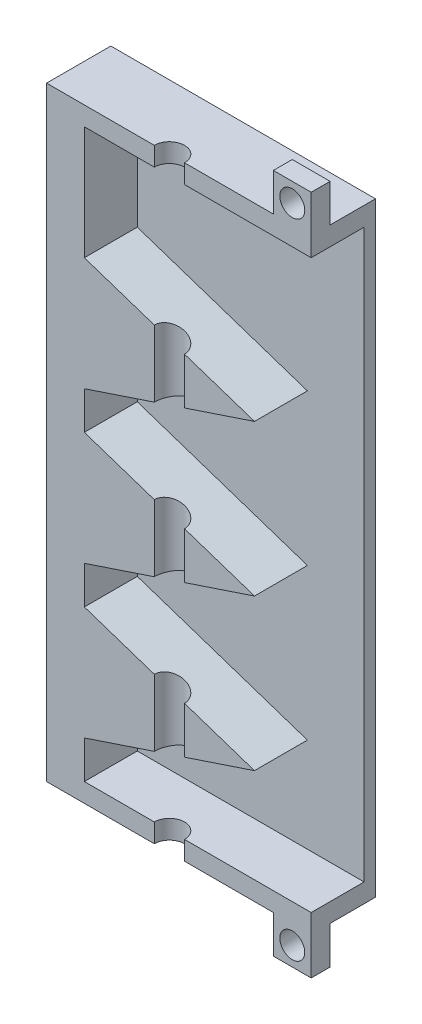
ISO-10303-21;
HEADER;
FILE_DESCRIPTION(('STEP AP214'),'2;1');
FILE_NAME('part.step','',(''),(''),'','','');
FILE_SCHEMA(('AUTOMOTIVE_DESIGN { 1 0 10303 214 1 1 1 1 }'));
ENDSEC;
DATA;
#1=APPLICATION_CONTEXT('core data for automotive mechanical design processes');
#2=APPLICATION_PROTOCOL_DEFINITION('international standard','automotive_design',2000,#1);
#3=PRODUCT_CONTEXT('',#1,'mechanical');
#4=PRODUCT('Part','Part','',(#3));
#5=PRODUCT_RELATED_PRODUCT_CATEGORY('part','',(#4));
#6=PRODUCT_DEFINITION_FORMATION('','',#4);
#7=PRODUCT_DEFINITION_CONTEXT('part definition',#1,'design');
#8=PRODUCT_DEFINITION('design','',#6,#7);
#9=PRODUCT_DEFINITION_SHAPE('','',#8);
#10=(LENGTH_UNIT() NAMED_UNIT(*) SI_UNIT(.MILLI.,.METRE.));
#11=(NAMED_UNIT(*) PLANE_ANGLE_UNIT() SI_UNIT($,.RADIAN.));
#12=(NAMED_UNIT(*) SI_UNIT($,.STERADIAN.) SOLID_ANGLE_UNIT());
#13=UNCERTAINTY_MEASURE_WITH_UNIT(LENGTH_MEASURE(1.E-05),#10,'distance_accuracy_value','');
#14=(GEOMETRIC_REPRESENTATION_CONTEXT(3) GLOBAL_UNCERTAINTY_ASSIGNED_CONTEXT((#13)) GLOBAL_UNIT_ASSIGNED_CONTEXT((#10,
#11,#12)) REPRESENTATION_CONTEXT('',''));
#15=CARTESIAN_POINT('',(0.,0.,0.));
#16=DIRECTION('',(0.,0.,1.));
#17=DIRECTION('',(1.,0.,0.));
#18=AXIS2_PLACEMENT_3D('',#15,#16,#17);
#19=CARTESIAN_POINT('',(0.,0.,-8.5));
#20=DIRECTION('',(0.,0.,-1.));
#21=DIRECTION('',(-1.,0.,0.));
#22=AXIS2_PLACEMENT_3D('',#19,#20,#21);
#23=PLANE('',#22);
#24=DIRECTION('',(0.,1.,0.));
#25=VECTOR('',#24,1.);
#26=CARTESIAN_POINT('',(18.25,-5.65685424949239,-8.5));
#27=LINE('',#26,#25);
#28=CARTESIAN_POINT('',(18.25,31.9166666666667,-8.5));
#29=VERTEX_POINT('',#28);
#30=CARTESIAN_POINT('',(18.25,38.0833333333333,-8.5));
#31=VERTEX_POINT('',#30);
#32=EDGE_CURVE('E446',#29,#31,#27,.T.);
#33=ORIENTED_EDGE('',*,*,#32,.F.);
#34=DIRECTION('',(-0.948683298050514,-0.316227766016838,0.));
#35=VECTOR('',#34,1.);
#36=CARTESIAN_POINT('',(5.00000000000001,27.5,-8.5));
#37=LINE('',#36,#35);
#38=CARTESIAN_POINT('',(27.5,35.,-8.5));
#39=VERTEX_POINT('',#38);
#40=EDGE_CURVE('E437',#39,#29,#37,.T.);
#41=ORIENTED_EDGE('',*,*,#40,.F.);
#42=DIRECTION('',(0.948683298050514,-0.316227766016838,0.));
#43=VECTOR('',#42,1.);
#44=CARTESIAN_POINT('',(27.5,35.,-8.5));
#45=LINE('',#44,#43);
#46=EDGE_CURVE('E439',#31,#39,#45,.T.);
#47=ORIENTED_EDGE('',*,*,#46,.F.);
#48=EDGE_LOOP('',(#33,#41,#47));
#49=FACE_BOUND('',#48,.T.);
#50=ADVANCED_FACE('F35',(#49),#23,.F.);
#51=DIRECTION('',(0.,1.,0.));
#52=VECTOR('',#51,1.);
#53=CARTESIAN_POINT('',(18.25,-5.65685424949239,-8.5));
#54=LINE('',#53,#52);
#55=CARTESIAN_POINT('',(18.25,51.9166666666667,-8.5));
#56=VERTEX_POINT('',#55);
#57=CARTESIAN_POINT('',(18.25,58.0833333333333,-8.5));
#58=VERTEX_POINT('',#57);
#59=EDGE_CURVE('E428',#56,#58,#54,.T.);
#60=ORIENTED_EDGE('',*,*,#59,.F.);
#61=DIRECTION('',(-0.948683298050514,-0.316227766016838,0.));
#62=VECTOR('',#61,1.);
#63=CARTESIAN_POINT('',(5.00000000000001,47.5,-8.5));
#64=LINE('',#63,#62);
#65=CARTESIAN_POINT('',(27.5,55.,-8.5));
#66=VERTEX_POINT('',#65);
#67=EDGE_CURVE('E451',#66,#56,#64,.T.);
#68=ORIENTED_EDGE('',*,*,#67,.F.);
#69=DIRECTION('',(0.948683298050514,-0.316227766016838,0.));
#70=VECTOR('',#69,1.);
#71=CARTESIAN_POINT('',(27.5,55.,-8.5));
#72=LINE('',#71,#70);
#73=EDGE_CURVE('E443',#58,#66,#72,.T.);
#74=ORIENTED_EDGE('',*,*,#73,.F.);
#75=EDGE_LOOP('',(#60,#68,#74));
#76=FACE_BOUND('',#75,.T.);
#77=ADVANCED_FACE('F518',(#76),#23,.F.);
#78=DIRECTION('',(0.,1.,0.));
#79=VECTOR('',#78,1.);
#80=CARTESIAN_POINT('',(18.25,-5.65685424949239,-8.5));
#81=LINE('',#80,#79);
#82=CARTESIAN_POINT('',(18.25,11.9166666666667,-8.5));
#83=VERTEX_POINT('',#82);
#84=CARTESIAN_POINT('',(18.25,18.0833333333333,-8.5));
#85=VERTEX_POINT('',#84);
#86=EDGE_CURVE('E425',#83,#85,#81,.T.);
#87=ORIENTED_EDGE('',*,*,#86,.F.);
#88=DIRECTION('',(-0.948683298050514,-0.316227766016838,0.));
#89=VECTOR('',#88,1.);
#90=CARTESIAN_POINT('',(5.00000000000001,7.49999999999999,-8.5));
#91=LINE('',#90,#89);
#92=CARTESIAN_POINT('',(27.5,15.,-8.5));
#93=VERTEX_POINT('',#92);
#94=EDGE_CURVE('E415',#93,#83,#91,.T.);
#95=ORIENTED_EDGE('',*,*,#94,.F.);
#96=DIRECTION('',(0.948683298050514,-0.316227766016838,0.));
#97=VECTOR('',#96,1.);
#98=CARTESIAN_POINT('',(27.5,15.,-8.5));
#99=LINE('',#98,#97);
#100=EDGE_CURVE('E417',#85,#93,#99,.T.);
#101=ORIENTED_EDGE('',*,*,#100,.F.);
#102=EDGE_LOOP('',(#87,#95,#101));
#103=FACE_BOUND('',#102,.T.);
#104=ADVANCED_FACE('F524',(#103),#23,.F.);
#105=DIRECTION('',(1.,0.,0.));
#106=VECTOR('',#105,1.);
#107=CARTESIAN_POINT('',(0.,80.,-8.5));
#108=LINE('',#107,#106);
#109=CARTESIAN_POINT('',(18.25,80.,-8.5));
#110=VERTEX_POINT('',#109);
#111=CARTESIAN_POINT('',(30.,80.,-8.5));
#112=VERTEX_POINT('',#111);
#113=EDGE_CURVE('E420',#110,#112,#108,.T.);
#114=ORIENTED_EDGE('',*,*,#113,.F.);
#115=DIRECTION('',(0.,1.,0.));
#116=VECTOR('',#115,1.);
#117=CARTESIAN_POINT('',(18.25,-5.65685424949239,-8.5));
#118=LINE('',#117,#116);
#119=CARTESIAN_POINT('',(18.25,77.5,-8.5));
#120=VERTEX_POINT('',#119);
#121=EDGE_CURVE('E395',#120,#110,#118,.T.);
#122=ORIENTED_EDGE('',*,*,#121,.F.);
#123=DIRECTION('',(1.,0.,0.));
#124=VECTOR('',#123,1.);
#125=CARTESIAN_POINT('',(5.,77.5,-8.5));
#126=LINE('',#125,#124);
#127=CARTESIAN_POINT('',(35.,77.5,-8.5));
#128=VERTEX_POINT('',#127);
#129=EDGE_CURVE('E410',#120,#128,#126,.T.);
#130=ORIENTED_EDGE('',*,*,#129,.T.);
#131=DIRECTION('',(0.,-1.,0.));
#132=VECTOR('',#131,1.);
#133=CARTESIAN_POINT('',(35.,80.,-8.5));
#134=LINE('',#133,#132);
#135=CARTESIAN_POINT('',(35.,85.,-8.5));
#136=VERTEX_POINT('',#135);
#137=EDGE_CURVE('E59',#136,#128,#134,.T.);
#138=ORIENTED_EDGE('',*,*,#137,.F.);
#139=DIRECTION('',(1.,0.,0.));
#140=VECTOR('',#139,1.);
#141=CARTESIAN_POINT('',(0.,85.,-8.5));
#142=LINE('',#141,#140);
#143=CARTESIAN_POINT('',(30.,85.,-8.5));
#144=VERTEX_POINT('',#143);
#145=EDGE_CURVE('E456',#144,#136,#142,.T.);
#146=ORIENTED_EDGE('',*,*,#145,.F.);
#147=DIRECTION('',(0.,1.,0.));
#148=VECTOR('',#147,1.);
#149=CARTESIAN_POINT('',(30.,85.,-8.5));
#150=LINE('',#149,#148);
#151=EDGE_CURVE('E458',#112,#144,#150,.T.);
#152=ORIENTED_EDGE('',*,*,#151,.F.);
#153=EDGE_LOOP('',(#114,#122,#130,#138,#146,#152));
#154=FACE_BOUND('',#153,.T.);
#155=CARTESIAN_POINT('',(32.5,82.5,-8.5));
#156=DIRECTION('',(0.,0.,-1.));
#157=DIRECTION('',(-1.,0.,0.));
#158=AXIS2_PLACEMENT_3D('',#155,#156,#157);
#159=CIRCLE('',#158,1.65);
#160=CARTESIAN_POINT('',(30.85,82.5,-8.5));
#161=VERTEX_POINT('',#160);
#162=EDGE_CURVE('E39',#161,#161,#159,.F.);
#163=ORIENTED_EDGE('',*,*,#162,.F.);
#164=EDGE_LOOP('',(#163));
#165=FACE_BOUND('',#164,.T.);
#166=ADVANCED_FACE('F519',(#154,#165),#23,.F.);
#167=DIRECTION('',(0.,1.,0.));
#168=VECTOR('',#167,1.);
#169=CARTESIAN_POINT('',(5.,2.5,-8.5));
#170=LINE('',#169,#168);
#171=CARTESIAN_POINT('',(5.,42.5,-8.5));
#172=VERTEX_POINT('',#171);
#173=CARTESIAN_POINT('',(5.,47.5,-8.5));
#174=VERTEX_POINT('',#173);
#175=EDGE_CURVE('E405',#172,#174,#170,.T.);
#176=ORIENTED_EDGE('',*,*,#175,.T.);
#177=CARTESIAN_POINT('',(14.25,50.5833333333333,-8.5));
#178=VERTEX_POINT('',#177);
#179=EDGE_CURVE('E450',#178,#174,#64,.T.);
#180=ORIENTED_EDGE('',*,*,#179,.F.);
#181=DIRECTION('',(0.,1.,0.));
#182=VECTOR('',#181,1.);
#183=CARTESIAN_POINT('',(14.25,-5.65685424949239,-8.5));
#184=LINE('',#183,#182);
#185=CARTESIAN_POINT('',(14.25,59.4166666666667,-8.5));
#186=VERTEX_POINT('',#185);
#187=EDGE_CURVE('E444',#186,#178,#184,.F.);
#188=ORIENTED_EDGE('',*,*,#187,.F.);
#189=CARTESIAN_POINT('',(5.,62.5,-8.5));
#190=VERTEX_POINT('',#189);
#191=EDGE_CURVE('E441',#190,#186,#72,.T.);
#192=ORIENTED_EDGE('',*,*,#191,.F.);
#193=DIRECTION('',(0.,1.,0.));
#194=VECTOR('',#193,1.);
#195=CARTESIAN_POINT('',(5.,2.5,-8.5));
#196=LINE('',#195,#194);
#197=CARTESIAN_POINT('',(5.,77.5,-8.5));
#198=VERTEX_POINT('',#197);
#199=EDGE_CURVE('E414',#190,#198,#196,.T.);
#200=ORIENTED_EDGE('',*,*,#199,.T.);
#201=CARTESIAN_POINT('',(14.25,77.5,-8.5));
#202=VERTEX_POINT('',#201);
#203=EDGE_CURVE('E399',#198,#202,#126,.T.);
#204=ORIENTED_EDGE('',*,*,#203,.T.);
#205=DIRECTION('',(0.,1.,0.));
#206=VECTOR('',#205,1.);
#207=CARTESIAN_POINT('',(14.25,-5.65685424949239,-8.5));
#208=LINE('',#207,#206);
#209=CARTESIAN_POINT('',(14.25,80.,-8.5));
#210=VERTEX_POINT('',#209);
#211=EDGE_CURVE('E423',#210,#202,#208,.F.);
#212=ORIENTED_EDGE('',*,*,#211,.F.);
#213=CARTESIAN_POINT('',(0.,80.,-8.5));
#214=VERTEX_POINT('',#213);
#215=EDGE_CURVE('E421',#214,#210,#108,.T.);
#216=ORIENTED_EDGE('',*,*,#215,.F.);
#217=DIRECTION('',(0.,1.,0.));
#218=VECTOR('',#217,1.);
#219=CARTESIAN_POINT('',(0.,80.,-8.5));
#220=LINE('',#219,#218);
#221=CARTESIAN_POINT('',(0.,0.,-8.5));
#222=VERTEX_POINT('',#221);
#223=EDGE_CURVE('E402',#222,#214,#220,.T.);
#224=ORIENTED_EDGE('',*,*,#223,.F.);
#225=DIRECTION('',(1.,0.,0.));
#226=VECTOR('',#225,1.);
#227=CARTESIAN_POINT('',(0.,0.,-8.5));
#228=LINE('',#227,#226);
#229=CARTESIAN_POINT('',(14.25,0.,-8.5));
#230=VERTEX_POINT('',#229);
#231=EDGE_CURVE('E406',#222,#230,#228,.T.);
#232=ORIENTED_EDGE('',*,*,#231,.T.);
#233=DIRECTION('',(0.,1.,0.));
#234=VECTOR('',#233,1.);
#235=CARTESIAN_POINT('',(14.25,-5.65685424949239,-8.5));
#236=LINE('',#235,#234);
#237=CARTESIAN_POINT('',(14.25,2.5,-8.5));
#238=VERTEX_POINT('',#237);
#239=EDGE_CURVE('E393',#238,#230,#236,.F.);
#240=ORIENTED_EDGE('',*,*,#239,.F.);
#241=DIRECTION('',(-1.,0.,0.));
#242=VECTOR('',#241,1.);
#243=CARTESIAN_POINT('',(5.,2.5,-8.5));
#244=LINE('',#243,#242);
#245=CARTESIAN_POINT('',(5.,2.5,-8.5));
#246=VERTEX_POINT('',#245);
#247=EDGE_CURVE('E396',#238,#246,#244,.T.);
#248=ORIENTED_EDGE('',*,*,#247,.T.);
#249=DIRECTION('',(0.,1.,0.));
#250=VECTOR('',#249,1.);
#251=CARTESIAN_POINT('',(5.,2.5,-8.5));
#252=LINE('',#251,#250);
#253=CARTESIAN_POINT('',(5.,7.5,-8.5));
#254=VERTEX_POINT('',#253);
#255=EDGE_CURVE('E411',#246,#254,#252,.T.);
#256=ORIENTED_EDGE('',*,*,#255,.T.);
#257=CARTESIAN_POINT('',(14.25,10.5833333333333,-8.5));
#258=VERTEX_POINT('',#257);
#259=EDGE_CURVE('E418',#258,#254,#91,.T.);
#260=ORIENTED_EDGE('',*,*,#259,.F.);
#261=DIRECTION('',(0.,1.,0.));
#262=VECTOR('',#261,1.);
#263=CARTESIAN_POINT('',(14.25,-5.65685424949239,-8.5));
#264=LINE('',#263,#262);
#265=CARTESIAN_POINT('',(14.25,19.4166666666667,-8.5));
#266=VERTEX_POINT('',#265);
#267=EDGE_CURVE('E426',#266,#258,#264,.F.);
#268=ORIENTED_EDGE('',*,*,#267,.F.);
#269=CARTESIAN_POINT('',(5.,22.5,-8.5));
#270=VERTEX_POINT('',#269);
#271=EDGE_CURVE('E429',#270,#266,#99,.T.);
#272=ORIENTED_EDGE('',*,*,#271,.F.);
#273=DIRECTION('',(0.,1.,0.));
#274=VECTOR('',#273,1.);
#275=CARTESIAN_POINT('',(5.,2.5,-8.5));
#276=LINE('',#275,#274);
#277=CARTESIAN_POINT('',(5.,27.5,-8.5));
#278=VERTEX_POINT('',#277);
#279=EDGE_CURVE('E434',#270,#278,#276,.T.);
#280=ORIENTED_EDGE('',*,*,#279,.T.);
#281=CARTESIAN_POINT('',(14.25,30.5833333333333,-8.5));
#282=VERTEX_POINT('',#281);
#283=EDGE_CURVE('E440',#282,#278,#37,.T.);
#284=ORIENTED_EDGE('',*,*,#283,.F.);
#285=DIRECTION('',(0.,1.,0.));
#286=VECTOR('',#285,1.);
#287=CARTESIAN_POINT('',(14.25,-5.65685424949239,-8.5));
#288=LINE('',#287,#286);
#289=CARTESIAN_POINT('',(14.25,39.4166666666667,-8.5));
#290=VERTEX_POINT('',#289);
#291=EDGE_CURVE('E408',#290,#282,#288,.F.);
#292=ORIENTED_EDGE('',*,*,#291,.F.);
#293=EDGE_CURVE('E448',#172,#290,#45,.T.);
#294=ORIENTED_EDGE('',*,*,#293,.F.);
#295=EDGE_LOOP('',(#176,#180,#188,#192,#200,#204,#212,#216,#224,#232,#240,#248,#256,#260,#268,
#272,#280,#284,#292,#294));
#296=FACE_BOUND('',#295,.T.);
#297=ADVANCED_FACE('F527',(#296),#23,.F.);
#298=CARTESIAN_POINT('',(32.5,-2.5,-8.5));
#299=DIRECTION('',(0.,0.,-1.));
#300=DIRECTION('',(-1.,0.,0.));
#301=AXIS2_PLACEMENT_3D('',#298,#299,#300);
#302=CIRCLE('',#301,1.65);
#303=CARTESIAN_POINT('',(30.85,-2.5,-8.5));
#304=VERTEX_POINT('',#303);
#305=EDGE_CURVE('E11',#304,#304,#302,.T.);
#306=ORIENTED_EDGE('',*,*,#305,.T.);
#307=EDGE_LOOP('',(#306));
#308=FACE_BOUND('',#307,.T.);
#309=DIRECTION('',(0.,-1.,0.));
#310=VECTOR('',#309,1.);
#311=CARTESIAN_POINT('',(30.,-5.,-8.5));
#312=LINE('',#311,#310);
#313=CARTESIAN_POINT('',(30.,0.,-8.5));
#314=VERTEX_POINT('',#313);
#315=CARTESIAN_POINT('',(30.,-5.,-8.5));
#316=VERTEX_POINT('',#315);
#317=EDGE_CURVE('E44',#314,#316,#312,.T.);
#318=ORIENTED_EDGE('',*,*,#317,.T.);
#319=DIRECTION('',(-1.,0.,0.));
#320=VECTOR('',#319,1.);
#321=CARTESIAN_POINT('',(0.,-5.,-8.5));
#322=LINE('',#321,#320);
#323=CARTESIAN_POINT('',(35.,-5.,-8.5));
#324=VERTEX_POINT('',#323);
#325=EDGE_CURVE('E272',#324,#316,#322,.T.);
#326=ORIENTED_EDGE('',*,*,#325,.F.);
#327=CARTESIAN_POINT('',(35.,2.5,-8.5));
#328=VERTEX_POINT('',#327);
#329=EDGE_CURVE('E403',#328,#324,#134,.T.);
#330=ORIENTED_EDGE('',*,*,#329,.F.);
#331=CARTESIAN_POINT('',(18.25,2.5,-8.5));
#332=VERTEX_POINT('',#331);
#333=EDGE_CURVE('E400',#328,#332,#244,.T.);
#334=ORIENTED_EDGE('',*,*,#333,.T.);
#335=DIRECTION('',(0.,1.,0.));
#336=VECTOR('',#335,1.);
#337=CARTESIAN_POINT('',(18.25,-5.65685424949239,-8.5));
#338=LINE('',#337,#336);
#339=CARTESIAN_POINT('',(18.25,0.,-8.5));
#340=VERTEX_POINT('',#339);
#341=EDGE_CURVE('E386',#340,#332,#338,.T.);
#342=ORIENTED_EDGE('',*,*,#341,.F.);
#343=EDGE_CURVE('E51',#340,#314,#228,.T.);
#344=ORIENTED_EDGE('',*,*,#343,.T.);
#345=EDGE_LOOP('',(#318,#326,#330,#334,#342,#344));
#346=FACE_BOUND('',#345,.T.);
#347=ADVANCED_FACE('F37',(#308,#346),#23,.F.);
#348=CARTESIAN_POINT('',(0.,80.,-17.));
#349=DIRECTION('',(0.,0.,1.));
#350=DIRECTION('',(1.,0.,0.));
#351=AXIS2_PLACEMENT_3D('',#348,#349,#350);
#352=PLANE('',#351);
#353=DIRECTION('',(-1.,0.,0.));
#354=VECTOR('',#353,1.);
#355=CARTESIAN_POINT('',(0.,0.,-17.));
#356=LINE('',#355,#354);
#357=CARTESIAN_POINT('',(35.,0.,-17.));
#358=VERTEX_POINT('',#357);
#359=CARTESIAN_POINT('',(0.,0.,-17.));
#360=VERTEX_POINT('',#359);
#361=EDGE_CURVE('E371',#358,#360,#356,.T.);
#362=ORIENTED_EDGE('',*,*,#361,.T.);
#363=DIRECTION('',(0.,-1.,0.));
#364=VECTOR('',#363,1.);
#365=CARTESIAN_POINT('',(0.,80.,-17.));
#366=LINE('',#365,#364);
#367=CARTESIAN_POINT('',(0.,80.,-17.));
#368=VERTEX_POINT('',#367);
#369=EDGE_CURVE('E375',#368,#360,#366,.T.);
#370=ORIENTED_EDGE('',*,*,#369,.F.);
#371=DIRECTION('',(-1.,0.,0.));
#372=VECTOR('',#371,1.);
#373=CARTESIAN_POINT('',(0.,80.,-17.));
#374=LINE('',#373,#372);
#375=CARTESIAN_POINT('',(35.,80.,-17.));
#376=VERTEX_POINT('',#375);
#377=EDGE_CURVE('E373',#376,#368,#374,.T.);
#378=ORIENTED_EDGE('',*,*,#377,.F.);
#379=DIRECTION('',(0.,-1.,0.));
#380=VECTOR('',#379,1.);
#381=CARTESIAN_POINT('',(35.,80.,-17.));
#382=LINE('',#381,#380);
#383=EDGE_CURVE('E383',#376,#358,#382,.T.);
#384=ORIENTED_EDGE('',*,*,#383,.T.);
#385=EDGE_LOOP('',(#362,#370,#378,#384));
#386=FACE_BOUND('',#385,.T.);
#387=ADVANCED_FACE('F538',(#386),#352,.F.);
#388=CARTESIAN_POINT('',(5.,2.5,-3.49999999999998));
#389=DIRECTION('',(1.,0.,0.));
#390=DIRECTION('',(0.,1.,0.));
#391=AXIS2_PLACEMENT_3D('',#388,#389,#390);
#392=PLANE('',#391);
#393=ORIENTED_EDGE('',*,*,#199,.F.);
#394=DIRECTION('',(0.,0.,-1.));
#395=VECTOR('',#394,1.);
#396=CARTESIAN_POINT('',(5.,62.5,23.5416345659799));
#397=LINE('',#396,#395);
#398=CARTESIAN_POINT('',(5.,62.5,-15.5));
#399=VERTEX_POINT('',#398);
#400=EDGE_CURVE('E327',#190,#399,#397,.T.);
#401=ORIENTED_EDGE('',*,*,#400,.T.);
#402=DIRECTION('',(0.,-1.,0.));
#403=VECTOR('',#402,1.);
#404=CARTESIAN_POINT('',(5.,2.5,-15.5));
#405=LINE('',#404,#403);
#406=CARTESIAN_POINT('',(5.,77.5,-15.5));
#407=VERTEX_POINT('',#406);
#408=EDGE_CURVE('E344',#407,#399,#405,.T.);
#409=ORIENTED_EDGE('',*,*,#408,.F.);
#410=DIRECTION('',(0.,0.,-1.));
#411=VECTOR('',#410,1.);
#412=CARTESIAN_POINT('',(5.,77.5,-3.5));
#413=LINE('',#412,#411);
#414=EDGE_CURVE('E358',#198,#407,#413,.T.);
#415=ORIENTED_EDGE('',*,*,#414,.F.);
#416=EDGE_LOOP('',(#393,#401,#409,#415));
#417=FACE_BOUND('',#416,.T.);
#418=ADVANCED_FACE('F545',(#417),#392,.T.);
#419=ORIENTED_EDGE('',*,*,#175,.F.);
#420=DIRECTION('',(0.,0.,-1.));
#421=VECTOR('',#420,1.);
#422=CARTESIAN_POINT('',(5.,42.5,23.5416345659799));
#423=LINE('',#422,#421);
#424=CARTESIAN_POINT('',(5.,42.5,-15.5));
#425=VERTEX_POINT('',#424);
#426=EDGE_CURVE('E315',#172,#425,#423,.T.);
#427=ORIENTED_EDGE('',*,*,#426,.T.);
#428=CARTESIAN_POINT('',(5.,47.5,-15.5));
#429=VERTEX_POINT('',#428);
#430=EDGE_CURVE('E348',#429,#425,#405,.T.);
#431=ORIENTED_EDGE('',*,*,#430,.F.);
#432=DIRECTION('',(0.,0.,-1.));
#433=VECTOR('',#432,1.);
#434=CARTESIAN_POINT('',(5.,47.5,23.5416345659799));
#435=LINE('',#434,#433);
#436=EDGE_CURVE('E312',#174,#429,#435,.T.);
#437=ORIENTED_EDGE('',*,*,#436,.F.);
#438=EDGE_LOOP('',(#419,#427,#431,#437));
#439=FACE_BOUND('',#438,.T.);
#440=ADVANCED_FACE('F573',(#439),#392,.T.);
#441=CARTESIAN_POINT('',(5.,2.5,-15.5));
#442=DIRECTION('',(0.,0.,-1.));
#443=DIRECTION('',(0.,1.,0.));
#444=AXIS2_PLACEMENT_3D('',#441,#442,#443);
#445=PLANE('',#444);
#446=DIRECTION('',(0.948683298050514,0.316227766016838,0.));
#447=VECTOR('',#446,1.);
#448=CARTESIAN_POINT('',(5.,27.5,-15.5));
#449=LINE('',#448,#447);
#450=CARTESIAN_POINT('',(5.,27.5,-15.5));
#451=VERTEX_POINT('',#450);
#452=CARTESIAN_POINT('',(27.5,35.,-15.5));
#453=VERTEX_POINT('',#452);
#454=EDGE_CURVE('E308',#451,#453,#449,.T.);
#455=ORIENTED_EDGE('',*,*,#454,.F.);
#456=CARTESIAN_POINT('',(5.,22.5,-15.5));
#457=VERTEX_POINT('',#456);
#458=EDGE_CURVE('E349',#451,#457,#405,.T.);
#459=ORIENTED_EDGE('',*,*,#458,.T.);
#460=DIRECTION('',(-0.948683298050514,0.316227766016838,0.));
#461=VECTOR('',#460,1.);
#462=CARTESIAN_POINT('',(27.5,15.,-15.5));
#463=LINE('',#462,#461);
#464=CARTESIAN_POINT('',(27.5,15.,-15.5));
#465=VERTEX_POINT('',#464);
#466=EDGE_CURVE('E334',#465,#457,#463,.T.);
#467=ORIENTED_EDGE('',*,*,#466,.F.);
#468=DIRECTION('',(0.948683298050514,0.316227766016838,0.));
#469=VECTOR('',#468,1.);
#470=CARTESIAN_POINT('',(5.,7.5,-15.5));
#471=LINE('',#470,#469);
#472=CARTESIAN_POINT('',(5.,7.5,-15.5));
#473=VERTEX_POINT('',#472);
#474=EDGE_CURVE('E321',#473,#465,#471,.T.);
#475=ORIENTED_EDGE('',*,*,#474,.F.);
#476=CARTESIAN_POINT('',(5.,2.5,-15.5));
#477=VERTEX_POINT('',#476);
#478=EDGE_CURVE('E343',#473,#477,#405,.T.);
#479=ORIENTED_EDGE('',*,*,#478,.T.);
#480=DIRECTION('',(1.,0.,0.));
#481=VECTOR('',#480,1.);
#482=CARTESIAN_POINT('',(5.,2.5,-15.5));
#483=LINE('',#482,#481);
#484=CARTESIAN_POINT('',(35.,2.5,-15.5));
#485=VERTEX_POINT('',#484);
#486=EDGE_CURVE('E347',#477,#485,#483,.T.);
#487=ORIENTED_EDGE('',*,*,#486,.T.);
#488=DIRECTION('',(0.,1.,0.));
#489=VECTOR('',#488,1.);
#490=CARTESIAN_POINT('',(35.,2.5,-15.5));
#491=LINE('',#490,#489);
#492=CARTESIAN_POINT('',(35.,77.5,-15.5));
#493=VERTEX_POINT('',#492);
#494=EDGE_CURVE('E352',#485,#493,#491,.T.);
#495=ORIENTED_EDGE('',*,*,#494,.T.);
#496=DIRECTION('',(-1.,0.,0.));
#497=VECTOR('',#496,1.);
#498=CARTESIAN_POINT('',(5.,77.5,-15.5));
#499=LINE('',#498,#497);
#500=EDGE_CURVE('E355',#493,#407,#499,.T.);
#501=ORIENTED_EDGE('',*,*,#500,.T.);
#502=ORIENTED_EDGE('',*,*,#408,.T.);
#503=DIRECTION('',(-0.948683298050514,0.316227766016838,0.));
#504=VECTOR('',#503,1.);
#505=CARTESIAN_POINT('',(27.5,55.,-15.5));
#506=LINE('',#505,#504);
#507=CARTESIAN_POINT('',(27.5,55.,-15.5));
#508=VERTEX_POINT('',#507);
#509=EDGE_CURVE('E324',#508,#399,#506,.T.);
#510=ORIENTED_EDGE('',*,*,#509,.F.);
#511=DIRECTION('',(0.948683298050514,0.316227766016838,0.));
#512=VECTOR('',#511,1.);
#513=CARTESIAN_POINT('',(5.,47.5,-15.5));
#514=LINE('',#513,#512);
#515=EDGE_CURVE('E307',#429,#508,#514,.T.);
#516=ORIENTED_EDGE('',*,*,#515,.F.);
#517=ORIENTED_EDGE('',*,*,#430,.T.);
#518=DIRECTION('',(-0.948683298050514,0.316227766016838,0.));
#519=VECTOR('',#518,1.);
#520=CARTESIAN_POINT('',(27.5,35.,-15.5));
#521=LINE('',#520,#519);
#522=EDGE_CURVE('E311',#453,#425,#521,.T.);
#523=ORIENTED_EDGE('',*,*,#522,.F.);
#524=EDGE_LOOP('',(#455,#459,#467,#475,#479,#487,#495,#501,#502,#510,#516,#517,#523));
#525=FACE_BOUND('',#524,.T.);
#526=ADVANCED_FACE('F576',(#525),#445,.F.);
#527=ORIENTED_EDGE('',*,*,#279,.F.);
#528=DIRECTION('',(0.,0.,-1.));
#529=VECTOR('',#528,1.);
#530=CARTESIAN_POINT('',(5.,22.5,23.5416345659799));
#531=LINE('',#530,#529);
#532=EDGE_CURVE('E337',#270,#457,#531,.T.);
#533=ORIENTED_EDGE('',*,*,#532,.T.);
#534=ORIENTED_EDGE('',*,*,#458,.F.);
#535=DIRECTION('',(0.,0.,-1.));
#536=VECTOR('',#535,1.);
#537=CARTESIAN_POINT('',(5.,27.5,23.5416345659799));
#538=LINE('',#537,#536);
#539=EDGE_CURVE('E319',#278,#451,#538,.T.);
#540=ORIENTED_EDGE('',*,*,#539,.F.);
#541=EDGE_LOOP('',(#527,#533,#534,#540));
#542=FACE_BOUND('',#541,.T.);
#543=ADVANCED_FACE('F578',(#542),#392,.T.);
#544=CARTESIAN_POINT('',(5.,27.5,23.5416345659799));
#545=DIRECTION('',(-0.316227766016838,0.948683298050514,0.));
#546=DIRECTION('',(-0.948683298050514,-0.316227766016838,0.));
#547=AXIS2_PLACEMENT_3D('',#544,#545,#546);
#548=PLANE('',#547);
#549=DIRECTION('',(0.,0.,-1.));
#550=VECTOR('',#549,1.);
#551=CARTESIAN_POINT('',(27.5,35.,23.5416345659799));
#552=LINE('',#551,#550);
#553=EDGE_CURVE('E317',#39,#453,#552,.T.);
#554=ORIENTED_EDGE('',*,*,#553,.F.);
#555=ORIENTED_EDGE('',*,*,#40,.T.);
#556=CARTESIAN_POINT('',(16.25,31.25,-8.5));
#557=DIRECTION('',(-0.316227766016838,0.948683298050514,0.));
#558=DIRECTION('',(0.948683298050514,0.316227766016838,0.));
#559=AXIS2_PLACEMENT_3D('',#556,#557,#558);
#560=ELLIPSE('',#559,2.10818510677892,2.);
#561=EDGE_CURVE('E387',#29,#282,#560,.T.);
#562=ORIENTED_EDGE('',*,*,#561,.T.);
#563=ORIENTED_EDGE('',*,*,#283,.T.);
#564=ORIENTED_EDGE('',*,*,#539,.T.);
#565=ORIENTED_EDGE('',*,*,#454,.T.);
#566=EDGE_LOOP('',(#554,#555,#562,#563,#564,#565));
#567=FACE_BOUND('',#566,.T.);
#568=ADVANCED_FACE('F607',(#567),#548,.F.);
#569=CARTESIAN_POINT('',(27.5,35.,23.5416345659799));
#570=DIRECTION('',(-0.316227766016838,-0.948683298050514,0.));
#571=DIRECTION('',(0.948683298050514,-0.316227766016838,0.));
#572=AXIS2_PLACEMENT_3D('',#569,#570,#571);
#573=PLANE('',#572);
#574=ORIENTED_EDGE('',*,*,#426,.F.);
#575=ORIENTED_EDGE('',*,*,#293,.T.);
#576=CARTESIAN_POINT('',(16.25,38.75,-8.5));
#577=DIRECTION('',(-0.316227766016838,-0.948683298050514,0.));
#578=DIRECTION('',(-0.948683298050514,0.316227766016838,0.));
#579=AXIS2_PLACEMENT_3D('',#576,#577,#578);
#580=ELLIPSE('',#579,2.10818510677892,2.);
#581=EDGE_CURVE('E390',#290,#31,#580,.T.);
#582=ORIENTED_EDGE('',*,*,#581,.T.);
#583=ORIENTED_EDGE('',*,*,#46,.T.);
#584=ORIENTED_EDGE('',*,*,#553,.T.);
#585=ORIENTED_EDGE('',*,*,#522,.T.);
#586=EDGE_LOOP('',(#574,#575,#582,#583,#584,#585));
#587=FACE_BOUND('',#586,.T.);
#588=ADVANCED_FACE('F475',(#587),#573,.F.);
#589=CARTESIAN_POINT('',(16.25,-5.65685424949239,-8.5));
#590=DIRECTION('',(0.,1.,0.));
#591=DIRECTION('',(0.,0.,1.));
#592=AXIS2_PLACEMENT_3D('',#589,#590,#591);
#593=CYLINDRICAL_SURFACE('',#592,2.);
#594=ORIENTED_EDGE('',*,*,#581,.F.);
#595=ORIENTED_EDGE('',*,*,#291,.T.);
#596=ORIENTED_EDGE('',*,*,#561,.F.);
#597=ORIENTED_EDGE('',*,*,#32,.T.);
#598=EDGE_LOOP('',(#594,#595,#596,#597));
#599=FACE_BOUND('',#598,.T.);
#600=ADVANCED_FACE('F470',(#599),#593,.F.);
#601=CARTESIAN_POINT('',(5.,47.5,23.5416345659799));
#602=DIRECTION('',(-0.316227766016838,0.948683298050514,0.));
#603=DIRECTION('',(-0.948683298050514,-0.316227766016838,0.));
#604=AXIS2_PLACEMENT_3D('',#601,#602,#603);
#605=PLANE('',#604);
#606=DIRECTION('',(0.,0.,-1.));
#607=VECTOR('',#606,1.);
#608=CARTESIAN_POINT('',(27.5,55.,23.5416345659799));
#609=LINE('',#608,#607);
#610=EDGE_CURVE('E329',#66,#508,#609,.T.);
#611=ORIENTED_EDGE('',*,*,#610,.F.);
#612=ORIENTED_EDGE('',*,*,#67,.T.);
#613=CARTESIAN_POINT('',(16.25,51.25,-8.5));
#614=DIRECTION('',(-0.316227766016838,0.948683298050514,0.));
#615=DIRECTION('',(0.948683298050514,0.316227766016838,0.));
#616=AXIS2_PLACEMENT_3D('',#613,#614,#615);
#617=ELLIPSE('',#616,2.10818510677892,2.);
#618=EDGE_CURVE('E477',#56,#178,#617,.T.);
#619=ORIENTED_EDGE('',*,*,#618,.T.);
#620=ORIENTED_EDGE('',*,*,#179,.T.);
#621=ORIENTED_EDGE('',*,*,#436,.T.);
#622=ORIENTED_EDGE('',*,*,#515,.T.);
#623=EDGE_LOOP('',(#611,#612,#619,#620,#621,#622));
#624=FACE_BOUND('',#623,.T.);
#625=ADVANCED_FACE('F598',(#624),#605,.F.);
#626=CARTESIAN_POINT('',(27.5,55.,23.5416345659799));
#627=DIRECTION('',(-0.316227766016838,-0.948683298050514,0.));
#628=DIRECTION('',(0.948683298050514,-0.316227766016838,0.));
#629=AXIS2_PLACEMENT_3D('',#626,#627,#628);
#630=PLANE('',#629);
#631=ORIENTED_EDGE('',*,*,#400,.F.);
#632=ORIENTED_EDGE('',*,*,#191,.T.);
#633=CARTESIAN_POINT('',(16.25,58.75,-8.5));
#634=DIRECTION('',(-0.316227766016838,-0.948683298050514,0.));
#635=DIRECTION('',(-0.948683298050514,0.316227766016838,0.));
#636=AXIS2_PLACEMENT_3D('',#633,#634,#635);
#637=ELLIPSE('',#636,2.10818510677892,2.);
#638=EDGE_CURVE('E480',#186,#58,#637,.T.);
#639=ORIENTED_EDGE('',*,*,#638,.T.);
#640=ORIENTED_EDGE('',*,*,#73,.T.);
#641=ORIENTED_EDGE('',*,*,#610,.T.);
#642=ORIENTED_EDGE('',*,*,#509,.T.);
#643=EDGE_LOOP('',(#631,#632,#639,#640,#641,#642));
#644=FACE_BOUND('',#643,.T.);
#645=ADVANCED_FACE('F601',(#644),#630,.F.);
#646=ORIENTED_EDGE('',*,*,#638,.F.);
#647=ORIENTED_EDGE('',*,*,#187,.T.);
#648=ORIENTED_EDGE('',*,*,#618,.F.);
#649=ORIENTED_EDGE('',*,*,#59,.T.);
#650=EDGE_LOOP('',(#646,#647,#648,#649));
#651=FACE_BOUND('',#650,.T.);
#652=ADVANCED_FACE('F605',(#651),#593,.F.);
#653=ORIENTED_EDGE('',*,*,#255,.F.);
#654=DIRECTION('',(0.,0.,-1.));
#655=VECTOR('',#654,1.);
#656=CARTESIAN_POINT('',(5.,2.5,-3.49999999999998));
#657=LINE('',#656,#655);
#658=EDGE_CURVE('E364',#246,#477,#657,.T.);
#659=ORIENTED_EDGE('',*,*,#658,.T.);
#660=ORIENTED_EDGE('',*,*,#478,.F.);
#661=DIRECTION('',(0.,0.,-1.));
#662=VECTOR('',#661,1.);
#663=CARTESIAN_POINT('',(5.,7.49999999999999,23.5416345659799));
#664=LINE('',#663,#662);
#665=EDGE_CURVE('E341',#254,#473,#664,.T.);
#666=ORIENTED_EDGE('',*,*,#665,.F.);
#667=EDGE_LOOP('',(#653,#659,#660,#666));
#668=FACE_BOUND('',#667,.T.);
#669=ADVANCED_FACE('F579',(#668),#392,.T.);
#670=CARTESIAN_POINT('',(5.,7.49999999999999,23.5416345659799));
#671=DIRECTION('',(-0.316227766016838,0.948683298050514,0.));
#672=DIRECTION('',(-0.948683298050514,-0.316227766016838,0.));
#673=AXIS2_PLACEMENT_3D('',#670,#671,#672);
#674=PLANE('',#673);
#675=DIRECTION('',(0.,0.,-1.));
#676=VECTOR('',#675,1.);
#677=CARTESIAN_POINT('',(27.5,15.,23.5416345659799));
#678=LINE('',#677,#676);
#679=EDGE_CURVE('E339',#93,#465,#678,.T.);
#680=ORIENTED_EDGE('',*,*,#679,.F.);
#681=ORIENTED_EDGE('',*,*,#94,.T.);
#682=CARTESIAN_POINT('',(16.25,11.25,-8.5));
#683=DIRECTION('',(-0.316227766016838,0.948683298050514,0.));
#684=DIRECTION('',(0.948683298050514,0.316227766016838,0.));
#685=AXIS2_PLACEMENT_3D('',#682,#683,#684);
#686=ELLIPSE('',#685,2.10818510677892,2.);
#687=EDGE_CURVE('E487',#83,#258,#686,.T.);
#688=ORIENTED_EDGE('',*,*,#687,.T.);
#689=ORIENTED_EDGE('',*,*,#259,.T.);
#690=ORIENTED_EDGE('',*,*,#665,.T.);
#691=ORIENTED_EDGE('',*,*,#474,.T.);
#692=EDGE_LOOP('',(#680,#681,#688,#689,#690,#691));
#693=FACE_BOUND('',#692,.T.);
#694=ADVANCED_FACE('F590',(#693),#674,.F.);
#695=CARTESIAN_POINT('',(27.5,15.,23.5416345659799));
#696=DIRECTION('',(-0.316227766016838,-0.948683298050514,0.));
#697=DIRECTION('',(0.948683298050514,-0.316227766016838,0.));
#698=AXIS2_PLACEMENT_3D('',#695,#696,#697);
#699=PLANE('',#698);
#700=ORIENTED_EDGE('',*,*,#532,.F.);
#701=ORIENTED_EDGE('',*,*,#271,.T.);
#702=CARTESIAN_POINT('',(16.25,18.75,-8.5));
#703=DIRECTION('',(-0.316227766016838,-0.948683298050514,0.));
#704=DIRECTION('',(-0.948683298050514,0.316227766016838,0.));
#705=AXIS2_PLACEMENT_3D('',#702,#703,#704);
#706=ELLIPSE('',#705,2.10818510677892,2.);
#707=EDGE_CURVE('E490',#266,#85,#706,.T.);
#708=ORIENTED_EDGE('',*,*,#707,.T.);
#709=ORIENTED_EDGE('',*,*,#100,.T.);
#710=ORIENTED_EDGE('',*,*,#679,.T.);
#711=ORIENTED_EDGE('',*,*,#466,.T.);
#712=EDGE_LOOP('',(#700,#701,#708,#709,#710,#711));
#713=FACE_BOUND('',#712,.T.);
#714=ADVANCED_FACE('F593',(#713),#699,.F.);
#715=ORIENTED_EDGE('',*,*,#707,.F.);
#716=ORIENTED_EDGE('',*,*,#267,.T.);
#717=ORIENTED_EDGE('',*,*,#687,.F.);
#718=ORIENTED_EDGE('',*,*,#86,.T.);
#719=EDGE_LOOP('',(#715,#716,#717,#718));
#720=FACE_BOUND('',#719,.T.);
#721=ADVANCED_FACE('F585',(#720),#593,.F.);
#722=CARTESIAN_POINT('',(5.,77.5,-3.5));
#723=DIRECTION('',(0.,-1.,0.));
#724=DIRECTION('',(1.,0.,0.));
#725=AXIS2_PLACEMENT_3D('',#722,#723,#724);
#726=PLANE('',#725);
#727=ORIENTED_EDGE('',*,*,#203,.F.);
#728=ORIENTED_EDGE('',*,*,#414,.T.);
#729=ORIENTED_EDGE('',*,*,#500,.F.);
#730=DIRECTION('',(0.,0.,-1.));
#731=VECTOR('',#730,1.);
#732=CARTESIAN_POINT('',(35.,77.5,-3.5));
#733=LINE('',#732,#731);
#734=EDGE_CURVE('E360',#128,#493,#733,.T.);
#735=ORIENTED_EDGE('',*,*,#734,.F.);
#736=ORIENTED_EDGE('',*,*,#129,.F.);
#737=CARTESIAN_POINT('',(16.25,77.5,-8.5));
#738=DIRECTION('',(0.,-1.,0.));
#739=DIRECTION('',(0.,0.,-1.));
#740=AXIS2_PLACEMENT_3D('',#737,#738,#739);
#741=CIRCLE('',#740,2.);
#742=EDGE_CURVE('E493',#202,#120,#741,.T.);
#743=ORIENTED_EDGE('',*,*,#742,.F.);
#744=EDGE_LOOP('',(#727,#728,#729,#735,#736,#743));
#745=FACE_BOUND('',#744,.T.);
#746=ADVANCED_FACE('F571',(#745),#726,.T.);
#747=CARTESIAN_POINT('',(0.,80.,0.));
#748=DIRECTION('',(0.,-1.,0.));
#749=DIRECTION('',(0.,0.,-1.));
#750=AXIS2_PLACEMENT_3D('',#747,#748,#749);
#751=PLANE('',#750);
#752=DIRECTION('',(0.,0.,1.));
#753=VECTOR('',#752,1.);
#754=CARTESIAN_POINT('',(0.,80.,0.));
#755=LINE('',#754,#753);
#756=EDGE_CURVE('E367',#368,#214,#755,.T.);
#757=ORIENTED_EDGE('',*,*,#756,.T.);
#758=ORIENTED_EDGE('',*,*,#215,.T.);
#759=CARTESIAN_POINT('',(16.25,80.,-8.5));
#760=DIRECTION('',(0.,1.,0.));
#761=DIRECTION('',(0.,0.,1.));
#762=AXIS2_PLACEMENT_3D('',#759,#760,#761);
#763=CIRCLE('',#762,2.);
#764=EDGE_CURVE('E851',#110,#210,#763,.T.);
#765=ORIENTED_EDGE('',*,*,#764,.F.);
#766=ORIENTED_EDGE('',*,*,#113,.T.);
#767=DIRECTION('',(0.,0.,1.));
#768=VECTOR('',#767,1.);
#769=CARTESIAN_POINT('',(30.,80.,-6.));
#770=LINE('',#769,#768);
#771=CARTESIAN_POINT('',(30.,80.,-11.));
#772=VERTEX_POINT('',#771);
#773=EDGE_CURVE('E288',#772,#112,#770,.T.);
#774=ORIENTED_EDGE('',*,*,#773,.F.);
#775=DIRECTION('',(-1.,0.,0.));
#776=VECTOR('',#775,1.);
#777=CARTESIAN_POINT('',(30.,80.,-11.));
#778=LINE('',#777,#776);
#779=CARTESIAN_POINT('',(35.,80.,-11.));
#780=VERTEX_POINT('',#779);
#781=EDGE_CURVE('E293',#780,#772,#778,.T.);
#782=ORIENTED_EDGE('',*,*,#781,.F.);
#783=DIRECTION('',(0.,0.,-1.));
#784=VECTOR('',#783,1.);
#785=CARTESIAN_POINT('',(35.,80.,0.));
#786=LINE('',#785,#784);
#787=EDGE_CURVE('E370',#780,#376,#786,.T.);
#788=ORIENTED_EDGE('',*,*,#787,.T.);
#789=ORIENTED_EDGE('',*,*,#377,.T.);
#790=EDGE_LOOP('',(#757,#758,#765,#766,#774,#782,#788,#789));
#791=FACE_BOUND('',#790,.T.);
#792=ADVANCED_FACE('F567',(#791),#751,.F.);
#793=ORIENTED_EDGE('',*,*,#764,.T.);
#794=ORIENTED_EDGE('',*,*,#211,.T.);
#795=ORIENTED_EDGE('',*,*,#742,.T.);
#796=ORIENTED_EDGE('',*,*,#121,.T.);
#797=EDGE_LOOP('',(#793,#794,#795,#796));
#798=FACE_BOUND('',#797,.T.);
#799=ADVANCED_FACE('F570',(#798),#593,.F.);
#800=CARTESIAN_POINT('',(30.,85.,-11.));
#801=DIRECTION('',(0.,0.,1.));
#802=DIRECTION('',(1.,0.,0.));
#803=AXIS2_PLACEMENT_3D('',#800,#801,#802);
#804=PLANE('',#803);
#805=CARTESIAN_POINT('',(32.5,82.5,-11.));
#806=DIRECTION('',(0.,0.,1.));
#807=DIRECTION('',(1.,0.,0.));
#808=AXIS2_PLACEMENT_3D('',#805,#806,#807);
#809=CIRCLE('',#808,1.65);
#810=CARTESIAN_POINT('',(34.15,82.5,-11.));
#811=VERTEX_POINT('',#810);
#812=EDGE_CURVE('E263',#811,#811,#809,.F.);
#813=ORIENTED_EDGE('',*,*,#812,.F.);
#814=EDGE_LOOP('',(#813));
#815=FACE_BOUND('',#814,.T.);
#816=ORIENTED_EDGE('',*,*,#781,.T.);
#817=DIRECTION('',(0.,-1.,0.));
#818=VECTOR('',#817,1.);
#819=CARTESIAN_POINT('',(30.,85.,-11.));
#820=LINE('',#819,#818);
#821=CARTESIAN_POINT('',(30.,85.,-11.));
#822=VERTEX_POINT('',#821);
#823=EDGE_CURVE('E297',#822,#772,#820,.T.);
#824=ORIENTED_EDGE('',*,*,#823,.F.);
#825=DIRECTION('',(-1.,0.,0.));
#826=VECTOR('',#825,1.);
#827=CARTESIAN_POINT('',(30.,85.,-11.));
#828=LINE('',#827,#826);
#829=CARTESIAN_POINT('',(35.,85.,-11.));
#830=VERTEX_POINT('',#829);
#831=EDGE_CURVE('E295',#830,#822,#828,.T.);
#832=ORIENTED_EDGE('',*,*,#831,.F.);
#833=DIRECTION('',(0.,-1.,0.));
#834=VECTOR('',#833,1.);
#835=CARTESIAN_POINT('',(35.,85.,-11.));
#836=LINE('',#835,#834);
#837=EDGE_CURVE('E304',#830,#780,#836,.T.);
#838=ORIENTED_EDGE('',*,*,#837,.T.);
#839=EDGE_LOOP('',(#816,#824,#832,#838));
#840=FACE_BOUND('',#839,.T.);
#841=ADVANCED_FACE('F616',(#815,#840),#804,.F.);
#842=CARTESIAN_POINT('',(32.5,82.5,-15.6669047558312));
#843=DIRECTION('',(0.,0.,1.));
#844=DIRECTION('',(1.,0.,0.));
#845=AXIS2_PLACEMENT_3D('',#842,#843,#844);
#846=CYLINDRICAL_SURFACE('',#845,1.65);
#847=ORIENTED_EDGE('',*,*,#162,.T.);
#848=EDGE_LOOP('',(#847));
#849=FACE_BOUND('',#848,.T.);
#850=ORIENTED_EDGE('',*,*,#812,.T.);
#851=EDGE_LOOP('',(#850));
#852=FACE_BOUND('',#851,.T.);
#853=ADVANCED_FACE('F565',(#849,#852),#846,.F.);
#854=CARTESIAN_POINT('',(0.,0.,0.));
#855=DIRECTION('',(0.,-1.,0.));
#856=DIRECTION('',(0.,0.,-1.));
#857=AXIS2_PLACEMENT_3D('',#854,#855,#856);
#858=PLANE('',#857);
#859=ORIENTED_EDGE('',*,*,#231,.F.);
#860=DIRECTION('',(0.,0.,1.));
#861=VECTOR('',#860,1.);
#862=CARTESIAN_POINT('',(0.,0.,0.));
#863=LINE('',#862,#861);
#864=EDGE_CURVE('E366',#360,#222,#863,.T.);
#865=ORIENTED_EDGE('',*,*,#864,.F.);
#866=ORIENTED_EDGE('',*,*,#361,.F.);
#867=DIRECTION('',(0.,0.,-1.));
#868=VECTOR('',#867,1.);
#869=CARTESIAN_POINT('',(35.,0.,0.));
#870=LINE('',#869,#868);
#871=CARTESIAN_POINT('',(35.,0.,-11.));
#872=VERTEX_POINT('',#871);
#873=EDGE_CURVE('E378',#872,#358,#870,.T.);
#874=ORIENTED_EDGE('',*,*,#873,.F.);
#875=DIRECTION('',(-1.,0.,0.));
#876=VECTOR('',#875,1.);
#877=CARTESIAN_POINT('',(30.,0.,-11.));
#878=LINE('',#877,#876);
#879=CARTESIAN_POINT('',(30.,0.,-11.));
#880=VERTEX_POINT('',#879);
#881=EDGE_CURVE('E273',#872,#880,#878,.T.);
#882=ORIENTED_EDGE('',*,*,#881,.T.);
#883=DIRECTION('',(0.,0.,1.));
#884=VECTOR('',#883,1.);
#885=CARTESIAN_POINT('',(30.,0.,-6.));
#886=LINE('',#885,#884);
#887=EDGE_CURVE('E258',#880,#314,#886,.T.);
#888=ORIENTED_EDGE('',*,*,#887,.T.);
#889=ORIENTED_EDGE('',*,*,#343,.F.);
#890=CARTESIAN_POINT('',(16.25,0.,-8.5));
#891=DIRECTION('',(0.,-1.,0.));
#892=DIRECTION('',(0.,0.,-1.));
#893=AXIS2_PLACEMENT_3D('',#890,#891,#892);
#894=CIRCLE('',#893,2.);
#895=EDGE_CURVE('E391',#340,#230,#894,.F.);
#896=ORIENTED_EDGE('',*,*,#895,.T.);
#897=EDGE_LOOP('',(#859,#865,#866,#874,#882,#888,#889,#896));
#898=FACE_BOUND('',#897,.T.);
#899=ADVANCED_FACE('F561',(#898),#858,.T.);
#900=CARTESIAN_POINT('',(5.,2.5,-3.49999999999998));
#901=DIRECTION('',(0.,1.,0.));
#902=DIRECTION('',(-1.,0.,0.));
#903=AXIS2_PLACEMENT_3D('',#900,#901,#902);
#904=PLANE('',#903);
#905=ORIENTED_EDGE('',*,*,#333,.F.);
#906=DIRECTION('',(0.,0.,-1.));
#907=VECTOR('',#906,1.);
#908=CARTESIAN_POINT('',(35.,2.5,-3.49999999999998));
#909=LINE('',#908,#907);
#910=EDGE_CURVE('E362',#328,#485,#909,.T.);
#911=ORIENTED_EDGE('',*,*,#910,.T.);
#912=ORIENTED_EDGE('',*,*,#486,.F.);
#913=ORIENTED_EDGE('',*,*,#658,.F.);
#914=ORIENTED_EDGE('',*,*,#247,.F.);
#915=CARTESIAN_POINT('',(16.25,2.5,-8.5));
#916=DIRECTION('',(0.,1.,0.));
#917=DIRECTION('',(0.,0.,1.));
#918=AXIS2_PLACEMENT_3D('',#915,#916,#917);
#919=CIRCLE('',#918,2.);
#920=EDGE_CURVE('E496',#332,#238,#919,.T.);
#921=ORIENTED_EDGE('',*,*,#920,.F.);
#922=EDGE_LOOP('',(#905,#911,#912,#913,#914,#921));
#923=FACE_BOUND('',#922,.T.);
#924=ADVANCED_FACE('F564',(#923),#904,.T.);
#925=ORIENTED_EDGE('',*,*,#920,.T.);
#926=ORIENTED_EDGE('',*,*,#239,.T.);
#927=ORIENTED_EDGE('',*,*,#895,.F.);
#928=ORIENTED_EDGE('',*,*,#341,.T.);
#929=EDGE_LOOP('',(#925,#926,#927,#928));
#930=FACE_BOUND('',#929,.T.);
#931=ADVANCED_FACE('F512',(#930),#593,.F.);
#932=CARTESIAN_POINT('',(30.,-5.,-11.));
#933=DIRECTION('',(0.,0.,-1.));
#934=DIRECTION('',(-1.,0.,0.));
#935=AXIS2_PLACEMENT_3D('',#932,#933,#934);
#936=PLANE('',#935);
#937=CARTESIAN_POINT('',(32.5,-2.5,-11.));
#938=DIRECTION('',(0.,0.,1.));
#939=DIRECTION('',(1.,0.,0.));
#940=AXIS2_PLACEMENT_3D('',#937,#938,#939);
#941=CIRCLE('',#940,1.65);
#942=CARTESIAN_POINT('',(34.15,-2.5,-11.));
#943=VERTEX_POINT('',#942);
#944=EDGE_CURVE('E283',#943,#943,#941,.T.);
#945=ORIENTED_EDGE('',*,*,#944,.T.);
#946=EDGE_LOOP('',(#945));
#947=FACE_BOUND('',#946,.T.);
#948=ORIENTED_EDGE('',*,*,#881,.F.);
#949=DIRECTION('',(0.,1.,0.));
#950=VECTOR('',#949,1.);
#951=CARTESIAN_POINT('',(35.,-5.,-11.));
#952=LINE('',#951,#950);
#953=CARTESIAN_POINT('',(35.,-5.,-11.));
#954=VERTEX_POINT('',#953);
#955=EDGE_CURVE('E264',#954,#872,#952,.T.);
#956=ORIENTED_EDGE('',*,*,#955,.F.);
#957=DIRECTION('',(-1.,0.,0.));
#958=VECTOR('',#957,1.);
#959=CARTESIAN_POINT('',(30.,-5.,-11.));
#960=LINE('',#959,#958);
#961=CARTESIAN_POINT('',(30.,-5.,-11.));
#962=VERTEX_POINT('',#961);
#963=EDGE_CURVE('E270',#954,#962,#960,.T.);
#964=ORIENTED_EDGE('',*,*,#963,.T.);
#965=DIRECTION('',(0.,1.,0.));
#966=VECTOR('',#965,1.);
#967=CARTESIAN_POINT('',(30.,-5.,-11.));
#968=LINE('',#967,#966);
#969=EDGE_CURVE('E253',#962,#880,#968,.T.);
#970=ORIENTED_EDGE('',*,*,#969,.T.);
#971=EDGE_LOOP('',(#948,#956,#964,#970));
#972=FACE_BOUND('',#971,.T.);
#973=ADVANCED_FACE('F276',(#947,#972),#936,.T.);
#974=CARTESIAN_POINT('',(32.5,-2.5,-15.6669047558312));
#975=DIRECTION('',(0.,0.,1.));
#976=DIRECTION('',(1.,0.,0.));
#977=AXIS2_PLACEMENT_3D('',#974,#975,#976);
#978=CYLINDRICAL_SURFACE('',#977,1.65);
#979=ORIENTED_EDGE('',*,*,#305,.F.);
#980=EDGE_LOOP('',(#979));
#981=FACE_BOUND('',#980,.T.);
#982=ORIENTED_EDGE('',*,*,#944,.F.);
#983=EDGE_LOOP('',(#982));
#984=FACE_BOUND('',#983,.T.);
#985=ADVANCED_FACE('F502',(#981,#984),#978,.F.);
#986=CARTESIAN_POINT('',(30.,-5.,-6.));
#987=DIRECTION('',(-1.,0.,0.));
#988=DIRECTION('',(0.,0.,1.));
#989=AXIS2_PLACEMENT_3D('',#986,#987,#988);
#990=PLANE('',#989);
#991=ORIENTED_EDGE('',*,*,#317,.F.);
#992=ORIENTED_EDGE('',*,*,#887,.F.);
#993=ORIENTED_EDGE('',*,*,#969,.F.);
#994=DIRECTION('',(0.,0.,1.));
#995=VECTOR('',#994,1.);
#996=CARTESIAN_POINT('',(30.,-5.,-6.));
#997=LINE('',#996,#995);
#998=EDGE_CURVE('E256',#962,#316,#997,.T.);
#999=ORIENTED_EDGE('',*,*,#998,.T.);
#1000=EDGE_LOOP('',(#991,#992,#993,#999));
#1001=FACE_BOUND('',#1000,.T.);
#1002=ADVANCED_FACE('F255',(#1001),#990,.T.);
#1003=CARTESIAN_POINT('',(35.,80.,0.));
#1004=DIRECTION('',(-1.,0.,0.));
#1005=DIRECTION('',(0.,0.,1.));
#1006=AXIS2_PLACEMENT_3D('',#1003,#1004,#1005);
#1007=PLANE('',#1006);
#1008=DIRECTION('',(0.,0.,-1.));
#1009=VECTOR('',#1008,1.);
#1010=CARTESIAN_POINT('',(35.,85.,-6.));
#1011=LINE('',#1010,#1009);
#1012=EDGE_CURVE('E292',#136,#830,#1011,.T.);
#1013=ORIENTED_EDGE('',*,*,#1012,.F.);
#1014=ORIENTED_EDGE('',*,*,#137,.T.);
#1015=ORIENTED_EDGE('',*,*,#734,.T.);
#1016=ORIENTED_EDGE('',*,*,#494,.F.);
#1017=ORIENTED_EDGE('',*,*,#910,.F.);
#1018=ORIENTED_EDGE('',*,*,#329,.T.);
#1019=DIRECTION('',(0.,0.,-1.));
#1020=VECTOR('',#1019,1.);
#1021=CARTESIAN_POINT('',(35.,-5.,-6.));
#1022=LINE('',#1021,#1020);
#1023=EDGE_CURVE('E277',#324,#954,#1022,.T.);
#1024=ORIENTED_EDGE('',*,*,#1023,.T.);
#1025=ORIENTED_EDGE('',*,*,#955,.T.);
#1026=ORIENTED_EDGE('',*,*,#873,.T.);
#1027=ORIENTED_EDGE('',*,*,#383,.F.);
#1028=ORIENTED_EDGE('',*,*,#787,.F.);
#1029=ORIENTED_EDGE('',*,*,#837,.F.);
#1030=EDGE_LOOP('',(#1013,#1014,#1015,#1016,#1017,#1018,#1024,#1025,#1026,#1027,#1028,#1029));
#1031=FACE_BOUND('',#1030,.T.);
#1032=ADVANCED_FACE('F510',(#1031),#1007,.F.);
#1033=CARTESIAN_POINT('',(0.,-5.,0.));
#1034=DIRECTION('',(0.,1.,0.));
#1035=DIRECTION('',(0.,0.,-1.));
#1036=AXIS2_PLACEMENT_3D('',#1033,#1034,#1035);
#1037=PLANE('',#1036);
#1038=ORIENTED_EDGE('',*,*,#1023,.F.);
#1039=ORIENTED_EDGE('',*,*,#325,.T.);
#1040=ORIENTED_EDGE('',*,*,#998,.F.);
#1041=ORIENTED_EDGE('',*,*,#963,.F.);
#1042=EDGE_LOOP('',(#1038,#1039,#1040,#1041));
#1043=FACE_BOUND('',#1042,.T.);
#1044=ADVANCED_FACE('F269',(#1043),#1037,.F.);
#1045=CARTESIAN_POINT('',(30.,85.,-6.));
#1046=DIRECTION('',(1.,0.,0.));
#1047=DIRECTION('',(0.,0.,-1.));
#1048=AXIS2_PLACEMENT_3D('',#1045,#1046,#1047);
#1049=PLANE('',#1048);
#1050=ORIENTED_EDGE('',*,*,#773,.T.);
#1051=ORIENTED_EDGE('',*,*,#151,.T.);
#1052=DIRECTION('',(0.,0.,1.));
#1053=VECTOR('',#1052,1.);
#1054=CARTESIAN_POINT('',(30.,85.,-6.));
#1055=LINE('',#1054,#1053);
#1056=EDGE_CURVE('E289',#822,#144,#1055,.T.);
#1057=ORIENTED_EDGE('',*,*,#1056,.F.);
#1058=ORIENTED_EDGE('',*,*,#823,.T.);
#1059=EDGE_LOOP('',(#1050,#1051,#1057,#1058));
#1060=FACE_BOUND('',#1059,.T.);
#1061=ADVANCED_FACE('F555',(#1060),#1049,.F.);
#1062=CARTESIAN_POINT('',(0.,85.,0.));
#1063=DIRECTION('',(0.,-1.,0.));
#1064=DIRECTION('',(0.,0.,-1.));
#1065=AXIS2_PLACEMENT_3D('',#1062,#1063,#1064);
#1066=PLANE('',#1065);
#1067=ORIENTED_EDGE('',*,*,#1056,.T.);
#1068=ORIENTED_EDGE('',*,*,#145,.T.);
#1069=ORIENTED_EDGE('',*,*,#1012,.T.);
#1070=ORIENTED_EDGE('',*,*,#831,.T.);
#1071=EDGE_LOOP('',(#1067,#1068,#1069,#1070));
#1072=FACE_BOUND('',#1071,.T.);
#1073=ADVANCED_FACE('F549',(#1072),#1066,.F.);
#1074=CARTESIAN_POINT('',(0.,80.,0.));
#1075=DIRECTION('',(1.,0.,0.));
#1076=DIRECTION('',(0.,0.,-1.));
#1077=AXIS2_PLACEMENT_3D('',#1074,#1075,#1076);
#1078=PLANE('',#1077);
#1079=ORIENTED_EDGE('',*,*,#864,.T.);
#1080=ORIENTED_EDGE('',*,*,#223,.T.);
#1081=ORIENTED_EDGE('',*,*,#756,.F.);
#1082=ORIENTED_EDGE('',*,*,#369,.T.);
#1083=EDGE_LOOP('',(#1079,#1080,#1081,#1082));
#1084=FACE_BOUND('',#1083,.T.);
#1085=ADVANCED_FACE('F540',(#1084),#1078,.F.);
#1086=CLOSED_SHELL('',(#50,#77,#104,#166,#297,#347,#387,#418,#440,#526,#543,#568,#588,#600,#625,
#645,#652,#669,#694,#714,#721,#746,#792,#799,#841,#853,#899,#924,#931,#973,#985,#1002,#1032,
#1044,#1061,#1073,#1085));
#1087=MANIFOLD_SOLID_BREP('B2',#1086);
#1088=ADVANCED_BREP_SHAPE_REPRESENTATION('',(#18,#1087),#14);
#1089=SHAPE_DEFINITION_REPRESENTATION(#9,#1088);
ENDSEC;
END-ISO-10303-21;
